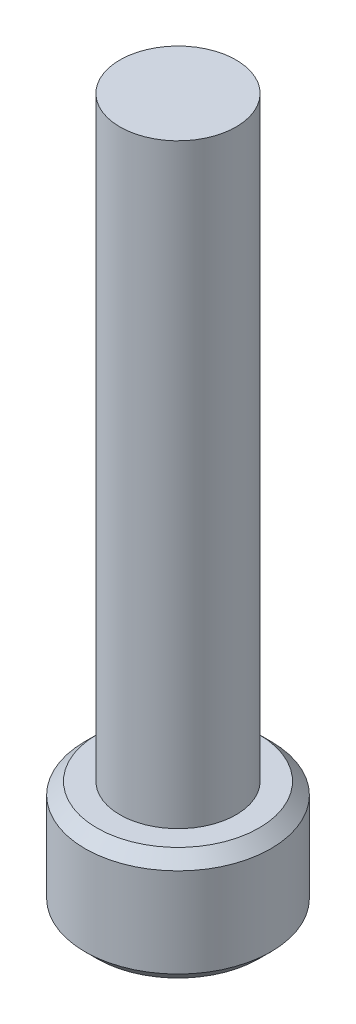
ISO-10303-21;
HEADER;
FILE_DESCRIPTION(('STEP AP214'),'2;1');
FILE_NAME('part.step','',(''),(''),'','','');
FILE_SCHEMA(('AUTOMOTIVE_DESIGN { 1 0 10303 214 1 1 1 1 }'));
ENDSEC;
DATA;
#1=APPLICATION_CONTEXT('core data for automotive mechanical design processes');
#2=APPLICATION_PROTOCOL_DEFINITION('international standard','automotive_design',2000,#1);
#3=PRODUCT_CONTEXT('',#1,'mechanical');
#4=PRODUCT('Part','Part','',(#3));
#5=PRODUCT_RELATED_PRODUCT_CATEGORY('part','',(#4));
#6=PRODUCT_DEFINITION_FORMATION('','',#4);
#7=PRODUCT_DEFINITION_CONTEXT('part definition',#1,'design');
#8=PRODUCT_DEFINITION('design','',#6,#7);
#9=PRODUCT_DEFINITION_SHAPE('','',#8);
#10=(LENGTH_UNIT() NAMED_UNIT(*) SI_UNIT(.MILLI.,.METRE.));
#11=(NAMED_UNIT(*) PLANE_ANGLE_UNIT() SI_UNIT($,.RADIAN.));
#12=(NAMED_UNIT(*) SI_UNIT($,.STERADIAN.) SOLID_ANGLE_UNIT());
#13=UNCERTAINTY_MEASURE_WITH_UNIT(LENGTH_MEASURE(1.E-05),#10,'distance_accuracy_value','');
#14=(GEOMETRIC_REPRESENTATION_CONTEXT(3) GLOBAL_UNCERTAINTY_ASSIGNED_CONTEXT((#13)) GLOBAL_UNIT_ASSIGNED_CONTEXT((#10,
#11,#12)) REPRESENTATION_CONTEXT('',''));
#15=CARTESIAN_POINT('',(0.,0.,0.));
#16=DIRECTION('',(0.,0.,1.));
#17=DIRECTION('',(1.,0.,0.));
#18=AXIS2_PLACEMENT_3D('',#15,#16,#17);
#19=CARTESIAN_POINT('',(0.,25.4,0.));
#20=DIRECTION('',(0.,-1.,0.));
#21=DIRECTION('',(0.,0.,-1.));
#22=AXIS2_PLACEMENT_3D('',#19,#20,#21);
#23=CYLINDRICAL_SURFACE('',#22,2.4765);
#24=CARTESIAN_POINT('',(0.,25.4,0.));
#25=DIRECTION('',(0.,1.,0.));
#26=DIRECTION('',(0.,0.,1.));
#27=AXIS2_PLACEMENT_3D('',#24,#25,#26);
#28=CIRCLE('',#27,2.4765);
#29=CARTESIAN_POINT('',(0.,25.4,2.4765));
#30=VERTEX_POINT('',#29);
#31=EDGE_CURVE('E150',#30,#30,#28,.T.);
#32=ORIENTED_EDGE('',*,*,#31,.F.);
#33=EDGE_LOOP('',(#32));
#34=FACE_BOUND('',#33,.T.);
#35=CARTESIAN_POINT('',(0.,0.,0.));
#36=DIRECTION('',(0.,1.,0.));
#37=DIRECTION('',(0.,0.,1.));
#38=AXIS2_PLACEMENT_3D('',#35,#36,#37);
#39=CIRCLE('',#38,2.4765);
#40=CARTESIAN_POINT('',(0.,0.,2.4765));
#41=VERTEX_POINT('',#40);
#42=EDGE_CURVE('E144',#41,#41,#39,.T.);
#43=ORIENTED_EDGE('',*,*,#42,.T.);
#44=EDGE_LOOP('',(#43));
#45=FACE_BOUND('',#44,.T.);
#46=ADVANCED_FACE('F41',(#34,#45),#23,.T.);
#47=CARTESIAN_POINT('',(0.,25.4,0.));
#48=DIRECTION('',(0.,1.,0.));
#49=DIRECTION('',(0.,0.,1.));
#50=AXIS2_PLACEMENT_3D('',#47,#48,#49);
#51=PLANE('',#50);
#52=ORIENTED_EDGE('',*,*,#31,.T.);
#53=EDGE_LOOP('',(#52));
#54=FACE_BOUND('',#53,.T.);
#55=ADVANCED_FACE('F175',(#54),#51,.T.);
#56=CARTESIAN_POINT('',(0.,-4.826,0.));
#57=DIRECTION('',(0.,1.,0.));
#58=DIRECTION('',(0.,0.,1.));
#59=AXIS2_PLACEMENT_3D('',#56,#57,#58);
#60=CYLINDRICAL_SURFACE('',#59,3.9624);
#61=CARTESIAN_POINT('',(0.,-0.508,0.));
#62=DIRECTION('',(0.,-1.,0.));
#63=DIRECTION('',(0.,0.,-1.));
#64=AXIS2_PLACEMENT_3D('',#61,#62,#63);
#65=CIRCLE('',#64,3.9624);
#66=CARTESIAN_POINT('',(0.,-0.508,-3.9624));
#67=VERTEX_POINT('',#66);
#68=EDGE_CURVE('E158',#67,#67,#65,.T.);
#69=ORIENTED_EDGE('',*,*,#68,.T.);
#70=EDGE_LOOP('',(#69));
#71=FACE_BOUND('',#70,.T.);
#72=CARTESIAN_POINT('',(0.,-4.31799999999999,0.));
#73=DIRECTION('',(0.,-1.,0.));
#74=DIRECTION('',(0.,0.,-1.));
#75=AXIS2_PLACEMENT_3D('',#72,#73,#74);
#76=CIRCLE('',#75,3.9624);
#77=CARTESIAN_POINT('',(0.,-4.31799999999999,-3.9624));
#78=VERTEX_POINT('',#77);
#79=EDGE_CURVE('E153',#78,#78,#76,.F.);
#80=ORIENTED_EDGE('',*,*,#79,.T.);
#81=EDGE_LOOP('',(#80));
#82=FACE_BOUND('',#81,.T.);
#83=ADVANCED_FACE('F171',(#71,#82),#60,.T.);
#84=CARTESIAN_POINT('',(0.,-4.826,0.));
#85=DIRECTION('',(0.,-1.,0.));
#86=DIRECTION('',(0.,0.,-1.));
#87=AXIS2_PLACEMENT_3D('',#84,#85,#86);
#88=PLANE('',#87);
#89=CARTESIAN_POINT('',(0.,-4.826,0.));
#90=DIRECTION('',(0.,-1.,0.));
#91=DIRECTION('',(0.,0.,-1.));
#92=AXIS2_PLACEMENT_3D('',#89,#90,#91);
#93=CIRCLE('',#92,3.4544);
#94=CARTESIAN_POINT('',(0.,-4.826,-3.4544));
#95=VERTEX_POINT('',#94);
#96=EDGE_CURVE('E11',#95,#95,#93,.T.);
#97=ORIENTED_EDGE('',*,*,#96,.T.);
#98=EDGE_LOOP('',(#97));
#99=FACE_BOUND('',#98,.T.);
#100=DIRECTION('',(0.5,0.,0.866025403784439));
#101=VECTOR('',#100,1.);
#102=CARTESIAN_POINT('',(1.14567944042316,-4.826,-1.984375));
#103=LINE('',#102,#101);
#104=CARTESIAN_POINT('',(1.14567944042316,-4.826,-1.984375));
#105=VERTEX_POINT('',#104);
#106=CARTESIAN_POINT('',(2.29135888084633,-4.826,0.));
#107=VERTEX_POINT('',#106);
#108=EDGE_CURVE('E57',#105,#107,#103,.T.);
#109=ORIENTED_EDGE('',*,*,#108,.F.);
#110=DIRECTION('',(1.,0.,0.));
#111=VECTOR('',#110,1.);
#112=CARTESIAN_POINT('',(-1.14567944042316,-4.826,-1.984375));
#113=LINE('',#112,#111);
#114=CARTESIAN_POINT('',(-1.14567944042316,-4.826,-1.984375));
#115=VERTEX_POINT('',#114);
#116=EDGE_CURVE('E140',#115,#105,#113,.T.);
#117=ORIENTED_EDGE('',*,*,#116,.F.);
#118=DIRECTION('',(0.5,0.,-0.866025403784439));
#119=VECTOR('',#118,1.);
#120=CARTESIAN_POINT('',(-2.29135888084633,-4.826,0.));
#121=LINE('',#120,#119);
#122=CARTESIAN_POINT('',(-2.29135888084633,-4.826,0.));
#123=VERTEX_POINT('',#122);
#124=EDGE_CURVE('E138',#123,#115,#121,.T.);
#125=ORIENTED_EDGE('',*,*,#124,.F.);
#126=DIRECTION('',(-0.5,0.,-0.866025403784439));
#127=VECTOR('',#126,1.);
#128=CARTESIAN_POINT('',(-1.14567944042316,-4.826,1.984375));
#129=LINE('',#128,#127);
#130=CARTESIAN_POINT('',(-1.14567944042316,-4.826,1.984375));
#131=VERTEX_POINT('',#130);
#132=EDGE_CURVE('E105',#131,#123,#129,.T.);
#133=ORIENTED_EDGE('',*,*,#132,.F.);
#134=DIRECTION('',(-1.,0.,0.));
#135=VECTOR('',#134,1.);
#136=CARTESIAN_POINT('',(1.14567944042316,-4.826,1.984375));
#137=LINE('',#136,#135);
#138=CARTESIAN_POINT('',(1.14567944042316,-4.826,1.984375));
#139=VERTEX_POINT('',#138);
#140=EDGE_CURVE('E134',#139,#131,#137,.T.);
#141=ORIENTED_EDGE('',*,*,#140,.F.);
#142=DIRECTION('',(-0.5,0.,0.866025403784439));
#143=VECTOR('',#142,1.);
#144=CARTESIAN_POINT('',(2.29135888084633,-4.826,0.));
#145=LINE('',#144,#143);
#146=EDGE_CURVE('E131',#107,#139,#145,.T.);
#147=ORIENTED_EDGE('',*,*,#146,.F.);
#148=EDGE_LOOP('',(#109,#117,#125,#133,#141,#147));
#149=FACE_BOUND('',#148,.T.);
#150=ADVANCED_FACE('F174',(#99,#149),#88,.T.);
#151=CARTESIAN_POINT('',(0.,0.,0.));
#152=DIRECTION('',(0.,-1.,0.));
#153=DIRECTION('',(0.,0.,-1.));
#154=AXIS2_PLACEMENT_3D('',#151,#152,#153);
#155=PLANE('',#154);
#156=CARTESIAN_POINT('',(0.,0.,0.));
#157=DIRECTION('',(0.,-1.,0.));
#158=DIRECTION('',(0.,0.,-1.));
#159=AXIS2_PLACEMENT_3D('',#156,#157,#158);
#160=CIRCLE('',#159,3.4544);
#161=CARTESIAN_POINT('',(0.,0.,-3.4544));
#162=VERTEX_POINT('',#161);
#163=EDGE_CURVE('E50',#162,#162,#160,.F.);
#164=ORIENTED_EDGE('',*,*,#163,.T.);
#165=EDGE_LOOP('',(#164));
#166=FACE_BOUND('',#165,.T.);
#167=ORIENTED_EDGE('',*,*,#42,.F.);
#168=EDGE_LOOP('',(#167));
#169=FACE_BOUND('',#168,.T.);
#170=ADVANCED_FACE('F163',(#166,#169),#155,.F.);
#171=CARTESIAN_POINT('',(1.14567944042316,-2.54,-1.984375));
#172=DIRECTION('',(0.866025403784439,0.,-0.5));
#173=DIRECTION('',(-0.5,0.,-0.866025403784439));
#174=AXIS2_PLACEMENT_3D('',#171,#172,#173);
#175=PLANE('',#174);
#176=ORIENTED_EDGE('',*,*,#108,.T.);
#177=DIRECTION('',(0.,-1.,0.));
#178=VECTOR('',#177,1.);
#179=CARTESIAN_POINT('',(2.29135888084633,-2.54,0.));
#180=LINE('',#179,#178);
#181=CARTESIAN_POINT('',(2.29135888084633,-2.54,0.));
#182=VERTEX_POINT('',#181);
#183=EDGE_CURVE('E87',#182,#107,#180,.T.);
#184=ORIENTED_EDGE('',*,*,#183,.F.);
#185=DIRECTION('',(0.5,0.,0.866025403784439));
#186=VECTOR('',#185,1.);
#187=CARTESIAN_POINT('',(1.14567944042316,-2.54,-1.984375));
#188=LINE('',#187,#186);
#189=CARTESIAN_POINT('',(1.14567944042316,-2.54,-1.984375));
#190=VERTEX_POINT('',#189);
#191=EDGE_CURVE('E142',#190,#182,#188,.T.);
#192=ORIENTED_EDGE('',*,*,#191,.F.);
#193=DIRECTION('',(0.,-1.,0.));
#194=VECTOR('',#193,1.);
#195=CARTESIAN_POINT('',(1.14567944042316,-2.54,-1.984375));
#196=LINE('',#195,#194);
#197=EDGE_CURVE('E65',#190,#105,#196,.T.);
#198=ORIENTED_EDGE('',*,*,#197,.T.);
#199=EDGE_LOOP('',(#176,#184,#192,#198));
#200=FACE_BOUND('',#199,.T.);
#201=ADVANCED_FACE('F192',(#200),#175,.F.);
#202=CARTESIAN_POINT('',(-1.14567944042316,-2.54,-1.984375));
#203=DIRECTION('',(0.,0.,-1.));
#204=DIRECTION('',(-1.,0.,0.));
#205=AXIS2_PLACEMENT_3D('',#202,#203,#204);
#206=PLANE('',#205);
#207=ORIENTED_EDGE('',*,*,#116,.T.);
#208=ORIENTED_EDGE('',*,*,#197,.F.);
#209=DIRECTION('',(1.,0.,0.));
#210=VECTOR('',#209,1.);
#211=CARTESIAN_POINT('',(-1.14567944042316,-2.54,-1.984375));
#212=LINE('',#211,#210);
#213=CARTESIAN_POINT('',(-1.14567944042316,-2.54,-1.984375));
#214=VERTEX_POINT('',#213);
#215=EDGE_CURVE('E117',#214,#190,#212,.T.);
#216=ORIENTED_EDGE('',*,*,#215,.F.);
#217=DIRECTION('',(0.,-1.,0.));
#218=VECTOR('',#217,1.);
#219=CARTESIAN_POINT('',(-1.14567944042316,-2.54,-1.984375));
#220=LINE('',#219,#218);
#221=EDGE_CURVE('E109',#214,#115,#220,.T.);
#222=ORIENTED_EDGE('',*,*,#221,.T.);
#223=EDGE_LOOP('',(#207,#208,#216,#222));
#224=FACE_BOUND('',#223,.T.);
#225=ADVANCED_FACE('F194',(#224),#206,.F.);
#226=CARTESIAN_POINT('',(-2.29135888084633,-2.54,0.));
#227=DIRECTION('',(-0.866025403784439,0.,-0.5));
#228=DIRECTION('',(-0.5,0.,0.866025403784439));
#229=AXIS2_PLACEMENT_3D('',#226,#227,#228);
#230=PLANE('',#229);
#231=ORIENTED_EDGE('',*,*,#124,.T.);
#232=ORIENTED_EDGE('',*,*,#221,.F.);
#233=DIRECTION('',(0.5,0.,-0.866025403784439));
#234=VECTOR('',#233,1.);
#235=CARTESIAN_POINT('',(-2.29135888084633,-2.54,0.));
#236=LINE('',#235,#234);
#237=CARTESIAN_POINT('',(-2.29135888084633,-2.54,0.));
#238=VERTEX_POINT('',#237);
#239=EDGE_CURVE('E113',#238,#214,#236,.T.);
#240=ORIENTED_EDGE('',*,*,#239,.F.);
#241=DIRECTION('',(0.,-1.,0.));
#242=VECTOR('',#241,1.);
#243=CARTESIAN_POINT('',(-2.29135888084633,-2.54,0.));
#244=LINE('',#243,#242);
#245=EDGE_CURVE('E98',#238,#123,#244,.T.);
#246=ORIENTED_EDGE('',*,*,#245,.T.);
#247=EDGE_LOOP('',(#231,#232,#240,#246));
#248=FACE_BOUND('',#247,.T.);
#249=ADVANCED_FACE('F114',(#248),#230,.F.);
#250=CARTESIAN_POINT('',(-1.14567944042316,-2.54,1.984375));
#251=DIRECTION('',(-0.866025403784439,0.,0.5));
#252=DIRECTION('',(0.5,0.,0.866025403784439));
#253=AXIS2_PLACEMENT_3D('',#250,#251,#252);
#254=PLANE('',#253);
#255=ORIENTED_EDGE('',*,*,#132,.T.);
#256=ORIENTED_EDGE('',*,*,#245,.F.);
#257=DIRECTION('',(-0.5,0.,-0.866025403784439));
#258=VECTOR('',#257,1.);
#259=CARTESIAN_POINT('',(-1.14567944042316,-2.54,1.984375));
#260=LINE('',#259,#258);
#261=CARTESIAN_POINT('',(-1.14567944042316,-2.54,1.984375));
#262=VERTEX_POINT('',#261);
#263=EDGE_CURVE('E102',#262,#238,#260,.T.);
#264=ORIENTED_EDGE('',*,*,#263,.F.);
#265=DIRECTION('',(0.,-1.,0.));
#266=VECTOR('',#265,1.);
#267=CARTESIAN_POINT('',(-1.14567944042316,-2.54,1.984375));
#268=LINE('',#267,#266);
#269=EDGE_CURVE('E110',#262,#131,#268,.T.);
#270=ORIENTED_EDGE('',*,*,#269,.T.);
#271=EDGE_LOOP('',(#255,#256,#264,#270));
#272=FACE_BOUND('',#271,.T.);
#273=ADVANCED_FACE('F100',(#272),#254,.F.);
#274=CARTESIAN_POINT('',(1.14567944042316,-2.54,1.984375));
#275=DIRECTION('',(0.,0.,1.));
#276=DIRECTION('',(1.,0.,0.));
#277=AXIS2_PLACEMENT_3D('',#274,#275,#276);
#278=PLANE('',#277);
#279=ORIENTED_EDGE('',*,*,#140,.T.);
#280=ORIENTED_EDGE('',*,*,#269,.F.);
#281=DIRECTION('',(-1.,0.,0.));
#282=VECTOR('',#281,1.);
#283=CARTESIAN_POINT('',(1.14567944042316,-2.54,1.984375));
#284=LINE('',#283,#282);
#285=CARTESIAN_POINT('',(1.14567944042316,-2.54,1.984375));
#286=VERTEX_POINT('',#285);
#287=EDGE_CURVE('E123',#286,#262,#284,.T.);
#288=ORIENTED_EDGE('',*,*,#287,.F.);
#289=DIRECTION('',(0.,-1.,0.));
#290=VECTOR('',#289,1.);
#291=CARTESIAN_POINT('',(1.14567944042316,-2.54,1.984375));
#292=LINE('',#291,#290);
#293=EDGE_CURVE('E147',#286,#139,#292,.T.);
#294=ORIENTED_EDGE('',*,*,#293,.T.);
#295=EDGE_LOOP('',(#279,#280,#288,#294));
#296=FACE_BOUND('',#295,.T.);
#297=ADVANCED_FACE('F271',(#296),#278,.F.);
#298=CARTESIAN_POINT('',(2.29135888084633,-2.54,0.));
#299=DIRECTION('',(0.866025403784439,0.,0.5));
#300=DIRECTION('',(0.5,0.,-0.866025403784439));
#301=AXIS2_PLACEMENT_3D('',#298,#299,#300);
#302=PLANE('',#301);
#303=ORIENTED_EDGE('',*,*,#146,.T.);
#304=ORIENTED_EDGE('',*,*,#293,.F.);
#305=DIRECTION('',(-0.5,0.,0.866025403784439));
#306=VECTOR('',#305,1.);
#307=CARTESIAN_POINT('',(2.29135888084633,-2.54,0.));
#308=LINE('',#307,#306);
#309=EDGE_CURVE('E125',#182,#286,#308,.T.);
#310=ORIENTED_EDGE('',*,*,#309,.F.);
#311=ORIENTED_EDGE('',*,*,#183,.T.);
#312=EDGE_LOOP('',(#303,#304,#310,#311));
#313=FACE_BOUND('',#312,.T.);
#314=ADVANCED_FACE('F190',(#313),#302,.F.);
#315=CARTESIAN_POINT('',(0.,-2.54,0.));
#316=DIRECTION('',(0.,-1.,0.));
#317=DIRECTION('',(0.,0.,-1.));
#318=AXIS2_PLACEMENT_3D('',#315,#316,#317);
#319=PLANE('',#318);
#320=ORIENTED_EDGE('',*,*,#191,.T.);
#321=ORIENTED_EDGE('',*,*,#309,.T.);
#322=ORIENTED_EDGE('',*,*,#287,.T.);
#323=ORIENTED_EDGE('',*,*,#263,.T.);
#324=ORIENTED_EDGE('',*,*,#239,.T.);
#325=ORIENTED_EDGE('',*,*,#215,.T.);
#326=EDGE_LOOP('',(#320,#321,#322,#323,#324,#325));
#327=FACE_BOUND('',#326,.T.);
#328=ADVANCED_FACE('F120',(#327),#319,.T.);
#329=CARTESIAN_POINT('',(0.,-0.508,0.));
#330=DIRECTION('',(0.,-1.,0.));
#331=DIRECTION('',(0.,0.,-1.));
#332=AXIS2_PLACEMENT_3D('',#329,#330,#331);
#333=CONICAL_SURFACE('',#332,3.9624,0.785398163397452);
#334=ORIENTED_EDGE('',*,*,#163,.F.);
#335=EDGE_LOOP('',(#334));
#336=FACE_BOUND('',#335,.T.);
#337=ORIENTED_EDGE('',*,*,#68,.F.);
#338=EDGE_LOOP('',(#337));
#339=FACE_BOUND('',#338,.T.);
#340=ADVANCED_FACE('F166',(#336,#339),#333,.T.);
#341=CARTESIAN_POINT('',(0.,-4.826,0.));
#342=DIRECTION('',(0.,1.,0.));
#343=DIRECTION('',(0.,0.,1.));
#344=AXIS2_PLACEMENT_3D('',#341,#342,#343);
#345=CONICAL_SURFACE('',#344,3.4544,0.785398163397445);
#346=ORIENTED_EDGE('',*,*,#79,.F.);
#347=EDGE_LOOP('',(#346));
#348=FACE_BOUND('',#347,.T.);
#349=ORIENTED_EDGE('',*,*,#96,.F.);
#350=EDGE_LOOP('',(#349));
#351=FACE_BOUND('',#350,.T.);
#352=ADVANCED_FACE('F44',(#348,#351),#345,.T.);
#353=CLOSED_SHELL('',(#46,#55,#83,#150,#170,#201,#225,#249,#273,#297,#314,#328,#340,#352));
#354=MANIFOLD_SOLID_BREP('B2',#353);
#355=ADVANCED_BREP_SHAPE_REPRESENTATION('',(#18,#354),#14);
#356=SHAPE_DEFINITION_REPRESENTATION(#9,#355);
ENDSEC;
END-ISO-10303-21;
